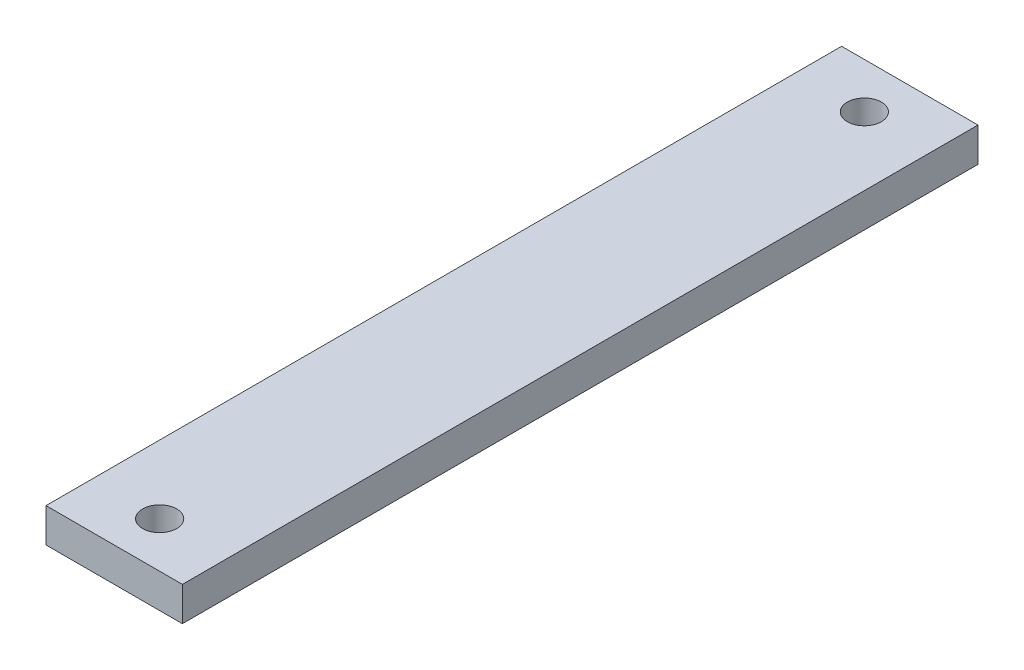
ISO-10303-21;
HEADER;
FILE_DESCRIPTION(('STEP AP214'),'2;1');
FILE_NAME('part.step','',(''),(''),'','','');
FILE_SCHEMA(('AUTOMOTIVE_DESIGN { 1 0 10303 214 1 1 1 1 }'));
ENDSEC;
DATA;
#1=APPLICATION_CONTEXT('core data for automotive mechanical design processes');
#2=APPLICATION_PROTOCOL_DEFINITION('international standard','automotive_design',2000,#1);
#3=PRODUCT_CONTEXT('',#1,'mechanical');
#4=PRODUCT('Part','Part','',(#3));
#5=PRODUCT_RELATED_PRODUCT_CATEGORY('part','',(#4));
#6=PRODUCT_DEFINITION_FORMATION('','',#4);
#7=PRODUCT_DEFINITION_CONTEXT('part definition',#1,'design');
#8=PRODUCT_DEFINITION('design','',#6,#7);
#9=PRODUCT_DEFINITION_SHAPE('','',#8);
#10=(LENGTH_UNIT() NAMED_UNIT(*) SI_UNIT(.MILLI.,.METRE.));
#11=(NAMED_UNIT(*) PLANE_ANGLE_UNIT() SI_UNIT($,.RADIAN.));
#12=(NAMED_UNIT(*) SI_UNIT($,.STERADIAN.) SOLID_ANGLE_UNIT());
#13=UNCERTAINTY_MEASURE_WITH_UNIT(LENGTH_MEASURE(1.E-05),#10,'distance_accuracy_value','');
#14=(GEOMETRIC_REPRESENTATION_CONTEXT(3) GLOBAL_UNCERTAINTY_ASSIGNED_CONTEXT((#13)) GLOBAL_UNIT_ASSIGNED_CONTEXT((#10,
#11,#12)) REPRESENTATION_CONTEXT('',''));
#15=CARTESIAN_POINT('',(0.,0.,0.));
#16=DIRECTION('',(0.,0.,1.));
#17=DIRECTION('',(1.,0.,0.));
#18=AXIS2_PLACEMENT_3D('',#15,#16,#17);
#19=CARTESIAN_POINT('',(0.,3.,0.));
#20=DIRECTION('',(1.,0.,0.));
#21=DIRECTION('',(0.,0.,-1.));
#22=AXIS2_PLACEMENT_3D('',#19,#20,#21);
#23=PLANE('',#22);
#24=DIRECTION('',(0.,0.,1.));
#25=VECTOR('',#24,1.);
#26=CARTESIAN_POINT('',(0.,0.,0.));
#27=LINE('',#26,#25);
#28=CARTESIAN_POINT('',(0.,0.,-70.));
#29=VERTEX_POINT('',#28);
#30=CARTESIAN_POINT('',(0.,0.,0.));
#31=VERTEX_POINT('',#30);
#32=EDGE_CURVE('E107',#29,#31,#27,.T.);
#33=ORIENTED_EDGE('',*,*,#32,.T.);
#34=DIRECTION('',(0.,-1.,0.));
#35=VECTOR('',#34,1.);
#36=CARTESIAN_POINT('',(0.,3.,0.));
#37=LINE('',#36,#35);
#38=CARTESIAN_POINT('',(0.,3.,0.));
#39=VERTEX_POINT('',#38);
#40=EDGE_CURVE('E11',#39,#31,#37,.T.);
#41=ORIENTED_EDGE('',*,*,#40,.F.);
#42=DIRECTION('',(0.,0.,1.));
#43=VECTOR('',#42,1.);
#44=CARTESIAN_POINT('',(0.,3.,0.));
#45=LINE('',#44,#43);
#46=CARTESIAN_POINT('',(0.,3.,-70.));
#47=VERTEX_POINT('',#46);
#48=EDGE_CURVE('E91',#47,#39,#45,.T.);
#49=ORIENTED_EDGE('',*,*,#48,.F.);
#50=DIRECTION('',(0.,-1.,0.));
#51=VECTOR('',#50,1.);
#52=CARTESIAN_POINT('',(0.,3.,-70.));
#53=LINE('',#52,#51);
#54=EDGE_CURVE('E103',#47,#29,#53,.T.);
#55=ORIENTED_EDGE('',*,*,#54,.T.);
#56=EDGE_LOOP('',(#33,#41,#49,#55));
#57=FACE_BOUND('',#56,.T.);
#58=ADVANCED_FACE('F39',(#57),#23,.F.);
#59=CARTESIAN_POINT('',(0.,3.,0.));
#60=DIRECTION('',(0.,0.,-1.));
#61=DIRECTION('',(-1.,0.,0.));
#62=AXIS2_PLACEMENT_3D('',#59,#60,#61);
#63=PLANE('',#62);
#64=DIRECTION('',(1.,0.,0.));
#65=VECTOR('',#64,1.);
#66=CARTESIAN_POINT('',(0.,0.,0.));
#67=LINE('',#66,#65);
#68=CARTESIAN_POINT('',(12.,0.,0.));
#69=VERTEX_POINT('',#68);
#70=EDGE_CURVE('E96',#31,#69,#67,.T.);
#71=ORIENTED_EDGE('',*,*,#70,.T.);
#72=DIRECTION('',(0.,-1.,0.));
#73=VECTOR('',#72,1.);
#74=CARTESIAN_POINT('',(12.,3.,0.));
#75=LINE('',#74,#73);
#76=CARTESIAN_POINT('',(12.,3.,0.));
#77=VERTEX_POINT('',#76);
#78=EDGE_CURVE('E48',#77,#69,#75,.T.);
#79=ORIENTED_EDGE('',*,*,#78,.F.);
#80=DIRECTION('',(1.,0.,0.));
#81=VECTOR('',#80,1.);
#82=CARTESIAN_POINT('',(0.,3.,0.));
#83=LINE('',#82,#81);
#84=EDGE_CURVE('E86',#39,#77,#83,.T.);
#85=ORIENTED_EDGE('',*,*,#84,.F.);
#86=ORIENTED_EDGE('',*,*,#40,.T.);
#87=EDGE_LOOP('',(#71,#79,#85,#86));
#88=FACE_BOUND('',#87,.T.);
#89=ADVANCED_FACE('F95',(#88),#63,.F.);
#90=CARTESIAN_POINT('',(12.,3.,0.));
#91=DIRECTION('',(-1.,0.,0.));
#92=DIRECTION('',(0.,0.,1.));
#93=AXIS2_PLACEMENT_3D('',#90,#91,#92);
#94=PLANE('',#93);
#95=DIRECTION('',(0.,0.,-1.));
#96=VECTOR('',#95,1.);
#97=CARTESIAN_POINT('',(12.,0.,0.));
#98=LINE('',#97,#96);
#99=CARTESIAN_POINT('',(12.,0.,-70.));
#100=VERTEX_POINT('',#99);
#101=EDGE_CURVE('E73',#69,#100,#98,.T.);
#102=ORIENTED_EDGE('',*,*,#101,.T.);
#103=DIRECTION('',(0.,-1.,0.));
#104=VECTOR('',#103,1.);
#105=CARTESIAN_POINT('',(12.,3.,-70.));
#106=LINE('',#105,#104);
#107=CARTESIAN_POINT('',(12.,3.,-70.));
#108=VERTEX_POINT('',#107);
#109=EDGE_CURVE('E98',#108,#100,#106,.T.);
#110=ORIENTED_EDGE('',*,*,#109,.F.);
#111=DIRECTION('',(0.,0.,-1.));
#112=VECTOR('',#111,1.);
#113=CARTESIAN_POINT('',(12.,3.,0.));
#114=LINE('',#113,#112);
#115=EDGE_CURVE('E89',#77,#108,#114,.T.);
#116=ORIENTED_EDGE('',*,*,#115,.F.);
#117=ORIENTED_EDGE('',*,*,#78,.T.);
#118=EDGE_LOOP('',(#102,#110,#116,#117));
#119=FACE_BOUND('',#118,.T.);
#120=ADVANCED_FACE('F99',(#119),#94,.F.);
#121=CARTESIAN_POINT('',(0.,3.,-70.));
#122=DIRECTION('',(0.,0.,1.));
#123=DIRECTION('',(1.,0.,0.));
#124=AXIS2_PLACEMENT_3D('',#121,#122,#123);
#125=PLANE('',#124);
#126=DIRECTION('',(-1.,0.,0.));
#127=VECTOR('',#126,1.);
#128=CARTESIAN_POINT('',(0.,0.,-70.));
#129=LINE('',#128,#127);
#130=EDGE_CURVE('E79',#100,#29,#129,.T.);
#131=ORIENTED_EDGE('',*,*,#130,.T.);
#132=ORIENTED_EDGE('',*,*,#54,.F.);
#133=DIRECTION('',(-1.,0.,0.));
#134=VECTOR('',#133,1.);
#135=CARTESIAN_POINT('',(0.,3.,-70.));
#136=LINE('',#135,#134);
#137=EDGE_CURVE('E56',#108,#47,#136,.T.);
#138=ORIENTED_EDGE('',*,*,#137,.F.);
#139=ORIENTED_EDGE('',*,*,#109,.T.);
#140=EDGE_LOOP('',(#131,#132,#138,#139));
#141=FACE_BOUND('',#140,.T.);
#142=ADVANCED_FACE('F121',(#141),#125,.F.);
#143=CARTESIAN_POINT('',(0.,3.,0.));
#144=DIRECTION('',(0.,-1.,0.));
#145=DIRECTION('',(0.,0.,-1.));
#146=AXIS2_PLACEMENT_3D('',#143,#144,#145);
#147=PLANE('',#146);
#148=CARTESIAN_POINT('',(6.,3.,-4.));
#149=DIRECTION('',(0.,1.,0.));
#150=DIRECTION('',(0.,0.,1.));
#151=AXIS2_PLACEMENT_3D('',#148,#149,#150);
#152=CIRCLE('',#151,1.5);
#153=CARTESIAN_POINT('',(6.,3.,-2.5));
#154=VERTEX_POINT('',#153);
#155=EDGE_CURVE('E136',#154,#154,#152,.T.);
#156=ORIENTED_EDGE('',*,*,#155,.F.);
#157=EDGE_LOOP('',(#156));
#158=FACE_BOUND('',#157,.T.);
#159=CARTESIAN_POINT('',(6.,3.,-66.));
#160=DIRECTION('',(0.,1.,0.));
#161=DIRECTION('',(0.,0.,1.));
#162=AXIS2_PLACEMENT_3D('',#159,#160,#161);
#163=CIRCLE('',#162,1.5);
#164=CARTESIAN_POINT('',(6.,3.,-64.5));
#165=VERTEX_POINT('',#164);
#166=EDGE_CURVE('E128',#165,#165,#163,.T.);
#167=ORIENTED_EDGE('',*,*,#166,.F.);
#168=EDGE_LOOP('',(#167));
#169=FACE_BOUND('',#168,.T.);
#170=ORIENTED_EDGE('',*,*,#48,.T.);
#171=ORIENTED_EDGE('',*,*,#84,.T.);
#172=ORIENTED_EDGE('',*,*,#115,.T.);
#173=ORIENTED_EDGE('',*,*,#137,.T.);
#174=EDGE_LOOP('',(#170,#171,#172,#173));
#175=FACE_BOUND('',#174,.T.);
#176=ADVANCED_FACE('F87',(#158,#169,#175),#147,.F.);
#177=CARTESIAN_POINT('',(0.,0.,0.));
#178=DIRECTION('',(0.,-1.,0.));
#179=DIRECTION('',(0.,0.,-1.));
#180=AXIS2_PLACEMENT_3D('',#177,#178,#179);
#181=PLANE('',#180);
#182=CARTESIAN_POINT('',(6.,0.,-4.));
#183=DIRECTION('',(0.,1.,0.));
#184=DIRECTION('',(0.,0.,1.));
#185=AXIS2_PLACEMENT_3D('',#182,#183,#184);
#186=CIRCLE('',#185,1.5);
#187=CARTESIAN_POINT('',(6.,0.,-2.5));
#188=VERTEX_POINT('',#187);
#189=EDGE_CURVE('E111',#188,#188,#186,.T.);
#190=ORIENTED_EDGE('',*,*,#189,.T.);
#191=EDGE_LOOP('',(#190));
#192=FACE_BOUND('',#191,.T.);
#193=CARTESIAN_POINT('',(6.,0.,-66.));
#194=DIRECTION('',(0.,1.,0.));
#195=DIRECTION('',(0.,0.,1.));
#196=AXIS2_PLACEMENT_3D('',#193,#194,#195);
#197=CIRCLE('',#196,1.5);
#198=CARTESIAN_POINT('',(6.,0.,-64.5));
#199=VERTEX_POINT('',#198);
#200=EDGE_CURVE('E132',#199,#199,#197,.T.);
#201=ORIENTED_EDGE('',*,*,#200,.T.);
#202=EDGE_LOOP('',(#201));
#203=FACE_BOUND('',#202,.T.);
#204=ORIENTED_EDGE('',*,*,#32,.F.);
#205=ORIENTED_EDGE('',*,*,#130,.F.);
#206=ORIENTED_EDGE('',*,*,#101,.F.);
#207=ORIENTED_EDGE('',*,*,#70,.F.);
#208=EDGE_LOOP('',(#204,#205,#206,#207));
#209=FACE_BOUND('',#208,.T.);
#210=ADVANCED_FACE('F124',(#192,#203,#209),#181,.T.);
#211=CARTESIAN_POINT('',(6.,0.,-66.));
#212=DIRECTION('',(0.,1.,0.));
#213=DIRECTION('',(0.,0.,1.));
#214=AXIS2_PLACEMENT_3D('',#211,#212,#213);
#215=CYLINDRICAL_SURFACE('',#214,1.5);
#216=ORIENTED_EDGE('',*,*,#200,.F.);
#217=EDGE_LOOP('',(#216));
#218=FACE_BOUND('',#217,.T.);
#219=ORIENTED_EDGE('',*,*,#166,.T.);
#220=EDGE_LOOP('',(#219));
#221=FACE_BOUND('',#220,.T.);
#222=ADVANCED_FACE('F149',(#218,#221),#215,.F.);
#223=CARTESIAN_POINT('',(6.,0.,-4.));
#224=DIRECTION('',(0.,1.,0.));
#225=DIRECTION('',(0.,0.,1.));
#226=AXIS2_PLACEMENT_3D('',#223,#224,#225);
#227=CYLINDRICAL_SURFACE('',#226,1.5);
#228=ORIENTED_EDGE('',*,*,#189,.F.);
#229=EDGE_LOOP('',(#228));
#230=FACE_BOUND('',#229,.T.);
#231=ORIENTED_EDGE('',*,*,#155,.T.);
#232=EDGE_LOOP('',(#231));
#233=FACE_BOUND('',#232,.T.);
#234=ADVANCED_FACE('F146',(#230,#233),#227,.F.);
#235=CLOSED_SHELL('',(#58,#89,#120,#142,#176,#210,#222,#234));
#236=MANIFOLD_SOLID_BREP('B2',#235);
#237=ADVANCED_BREP_SHAPE_REPRESENTATION('',(#18,#236),#14);
#238=SHAPE_DEFINITION_REPRESENTATION(#9,#237);
ENDSEC;
END-ISO-10303-21;
